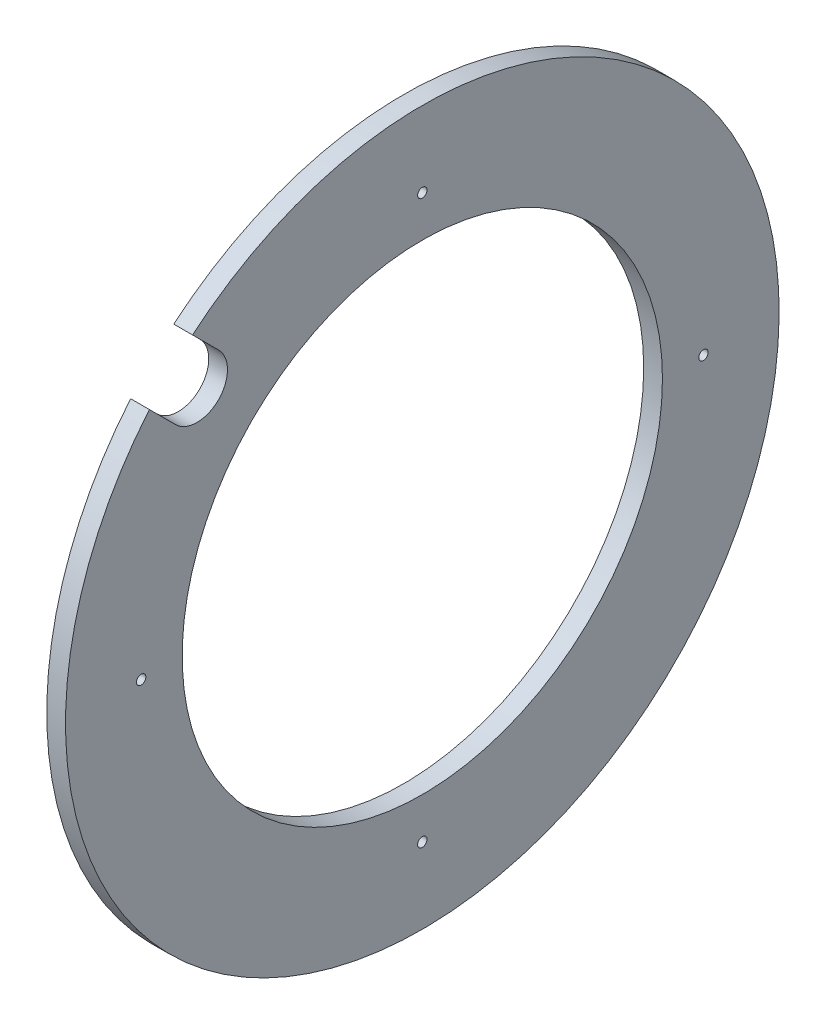
ISO-10303-21;
HEADER;
FILE_DESCRIPTION(('STEP AP214'),'2;1');
FILE_NAME('part.step','',(''),(''),'','','');
FILE_SCHEMA(('AUTOMOTIVE_DESIGN { 1 0 10303 214 1 1 1 1 }'));
ENDSEC;
DATA;
#1=APPLICATION_CONTEXT('core data for automotive mechanical design processes');
#2=APPLICATION_PROTOCOL_DEFINITION('international standard','automotive_design',2000,#1);
#3=PRODUCT_CONTEXT('',#1,'mechanical');
#4=PRODUCT('Part','Part','',(#3));
#5=PRODUCT_RELATED_PRODUCT_CATEGORY('part','',(#4));
#6=PRODUCT_DEFINITION_FORMATION('','',#4);
#7=PRODUCT_DEFINITION_CONTEXT('part definition',#1,'design');
#8=PRODUCT_DEFINITION('design','',#6,#7);
#9=PRODUCT_DEFINITION_SHAPE('','',#8);
#10=(LENGTH_UNIT() NAMED_UNIT(*) SI_UNIT(.MILLI.,.METRE.));
#11=(NAMED_UNIT(*) PLANE_ANGLE_UNIT() SI_UNIT($,.RADIAN.));
#12=(NAMED_UNIT(*) SI_UNIT($,.STERADIAN.) SOLID_ANGLE_UNIT());
#13=UNCERTAINTY_MEASURE_WITH_UNIT(LENGTH_MEASURE(1.E-05),#10,'distance_accuracy_value','');
#14=(GEOMETRIC_REPRESENTATION_CONTEXT(3) GLOBAL_UNCERTAINTY_ASSIGNED_CONTEXT((#13)) GLOBAL_UNIT_ASSIGNED_CONTEXT((#10,
#11,#12)) REPRESENTATION_CONTEXT('',''));
#15=CARTESIAN_POINT('',(0.,0.,0.));
#16=DIRECTION('',(0.,0.,1.));
#17=DIRECTION('',(1.,0.,0.));
#18=AXIS2_PLACEMENT_3D('',#15,#16,#17);
#19=CARTESIAN_POINT('',(4.,0.,0.));
#20=DIRECTION('',(1.,0.,0.));
#21=DIRECTION('',(0.,0.,-1.));
#22=AXIS2_PLACEMENT_3D('',#19,#20,#21);
#23=PLANE('',#22);
#24=DIRECTION('',(0.,-0.707106781186546,-0.707106781186549));
#25=VECTOR('',#24,1.);
#26=CARTESIAN_POINT('',(4.,43.4870670429726,52.6794551983979));
#27=LINE('',#26,#25);
#28=CARTESIAN_POINT('',(4.,49.0534680833858,58.2458562388111));
#29=VERTEX_POINT('',#28);
#30=CARTESIAN_POINT('',(4.,43.4870670429726,52.6794551983979));
#31=VERTEX_POINT('',#30);
#32=EDGE_CURVE('E83',#29,#31,#27,.T.);
#33=ORIENTED_EDGE('',*,*,#32,.F.);
#34=CARTESIAN_POINT('',(4.,0.,0.));
#35=DIRECTION('',(1.,0.,0.));
#36=DIRECTION('',(0.,0.,-1.));
#37=AXIS2_PLACEMENT_3D('',#34,#35,#36);
#38=CIRCLE('',#37,76.15);
#39=CARTESIAN_POINT('',(4.,58.2458562388109,49.053468083386));
#40=VERTEX_POINT('',#39);
#41=EDGE_CURVE('E95',#29,#40,#38,.T.);
#42=ORIENTED_EDGE('',*,*,#41,.T.);
#43=DIRECTION('',(0.,0.707106781186546,0.707106781186549));
#44=VECTOR('',#43,1.);
#45=CARTESIAN_POINT('',(4.,52.6794551983977,43.4870670429728));
#46=LINE('',#45,#44);
#47=CARTESIAN_POINT('',(4.,52.6794551983977,43.4870670429728));
#48=VERTEX_POINT('',#47);
#49=EDGE_CURVE('E51',#48,#40,#46,.T.);
#50=ORIENTED_EDGE('',*,*,#49,.F.);
#51=CARTESIAN_POINT('',(4.,48.0832611206851,48.0832611206853));
#52=DIRECTION('',(1.,0.,0.));
#53=DIRECTION('',(0.,0.,-1.));
#54=AXIS2_PLACEMENT_3D('',#51,#52,#53);
#55=CIRCLE('',#54,6.5);
#56=EDGE_CURVE('E86',#31,#48,#55,.T.);
#57=ORIENTED_EDGE('',*,*,#56,.F.);
#58=EDGE_LOOP('',(#33,#42,#50,#57));
#59=FACE_BOUND('',#58,.T.);
#60=CARTESIAN_POINT('',(4.,1.69795468502936E-12,-60.0000000000019));
#61=DIRECTION('',(1.,0.,0.));
#62=DIRECTION('',(0.,0.,-1.));
#63=AXIS2_PLACEMENT_3D('',#60,#61,#62);
#64=CIRCLE('',#63,0.999999999999998);
#65=CARTESIAN_POINT('',(4.,1.69795468502936E-12,-61.0000000000019));
#66=VERTEX_POINT('',#65);
#67=EDGE_CURVE('E107',#66,#66,#64,.T.);
#68=ORIENTED_EDGE('',*,*,#67,.F.);
#69=EDGE_LOOP('',(#68));
#70=FACE_BOUND('',#69,.T.);
#71=CARTESIAN_POINT('',(4.,-60.,-3.59206192068241E-12));
#72=DIRECTION('',(1.,0.,0.));
#73=DIRECTION('',(0.,0.,-1.));
#74=AXIS2_PLACEMENT_3D('',#71,#72,#73);
#75=CIRCLE('',#74,1.);
#76=CARTESIAN_POINT('',(4.,-60.,-1.00000000000359));
#77=VERTEX_POINT('',#76);
#78=EDGE_CURVE('E113',#77,#77,#75,.T.);
#79=ORIENTED_EDGE('',*,*,#78,.F.);
#80=EDGE_LOOP('',(#79));
#81=FACE_BOUND('',#80,.T.);
#82=CARTESIAN_POINT('',(4.,-1.70530256582424E-12,59.9999999999981));
#83=DIRECTION('',(1.,0.,0.));
#84=DIRECTION('',(0.,0.,-1.));
#85=AXIS2_PLACEMENT_3D('',#82,#83,#84);
#86=CIRCLE('',#85,0.999999999999998);
#87=CARTESIAN_POINT('',(4.,-1.70530256582424E-12,58.9999999999981));
#88=VERTEX_POINT('',#87);
#89=EDGE_CURVE('E102',#88,#88,#86,.T.);
#90=ORIENTED_EDGE('',*,*,#89,.F.);
#91=EDGE_LOOP('',(#90));
#92=FACE_BOUND('',#91,.T.);
#93=CARTESIAN_POINT('',(4.,60.,-1.96152550623697E-13));
#94=DIRECTION('',(1.,0.,0.));
#95=DIRECTION('',(0.,0.,-1.));
#96=AXIS2_PLACEMENT_3D('',#93,#94,#95);
#97=CIRCLE('',#96,1.);
#98=CARTESIAN_POINT('',(4.,60.,-1.0000000000002));
#99=VERTEX_POINT('',#98);
#100=EDGE_CURVE('E106',#99,#99,#97,.T.);
#101=ORIENTED_EDGE('',*,*,#100,.F.);
#102=EDGE_LOOP('',(#101));
#103=FACE_BOUND('',#102,.T.);
#104=CARTESIAN_POINT('',(4.,0.,0.));
#105=DIRECTION('',(1.,0.,0.));
#106=DIRECTION('',(0.,0.,-1.));
#107=AXIS2_PLACEMENT_3D('',#104,#105,#106);
#108=CIRCLE('',#107,51.25);
#109=CARTESIAN_POINT('',(4.,0.,-51.25));
#110=VERTEX_POINT('',#109);
#111=EDGE_CURVE('E127',#110,#110,#108,.T.);
#112=ORIENTED_EDGE('',*,*,#111,.F.);
#113=EDGE_LOOP('',(#112));
#114=FACE_BOUND('',#113,.T.);
#115=ADVANCED_FACE('F36',(#59,#70,#81,#92,#103,#114),#23,.T.);
#116=CARTESIAN_POINT('',(0.,0.,0.));
#117=DIRECTION('',(1.,0.,0.));
#118=DIRECTION('',(0.,0.,-1.));
#119=AXIS2_PLACEMENT_3D('',#116,#117,#118);
#120=PLANE('',#119);
#121=CARTESIAN_POINT('',(0.,1.69795468502936E-12,-60.0000000000019));
#122=DIRECTION('',(1.,0.,0.));
#123=DIRECTION('',(0.,0.,-1.));
#124=AXIS2_PLACEMENT_3D('',#121,#122,#123);
#125=CIRCLE('',#124,0.999999999999998);
#126=CARTESIAN_POINT('',(0.,1.69795468502936E-12,-61.0000000000019));
#127=VERTEX_POINT('',#126);
#128=EDGE_CURVE('E103',#127,#127,#125,.T.);
#129=ORIENTED_EDGE('',*,*,#128,.T.);
#130=EDGE_LOOP('',(#129));
#131=FACE_BOUND('',#130,.T.);
#132=CARTESIAN_POINT('',(0.,-60.,-3.59206192068241E-12));
#133=DIRECTION('',(1.,0.,0.));
#134=DIRECTION('',(0.,0.,-1.));
#135=AXIS2_PLACEMENT_3D('',#132,#133,#134);
#136=CIRCLE('',#135,1.);
#137=CARTESIAN_POINT('',(0.,-60.,-1.00000000000359));
#138=VERTEX_POINT('',#137);
#139=EDGE_CURVE('E110',#138,#138,#136,.T.);
#140=ORIENTED_EDGE('',*,*,#139,.T.);
#141=EDGE_LOOP('',(#140));
#142=FACE_BOUND('',#141,.T.);
#143=CARTESIAN_POINT('',(0.,-1.70530256582424E-12,59.9999999999981));
#144=DIRECTION('',(1.,0.,0.));
#145=DIRECTION('',(0.,0.,-1.));
#146=AXIS2_PLACEMENT_3D('',#143,#144,#145);
#147=CIRCLE('',#146,0.999999999999998);
#148=CARTESIAN_POINT('',(0.,-1.70530256582424E-12,58.9999999999981));
#149=VERTEX_POINT('',#148);
#150=EDGE_CURVE('E116',#149,#149,#147,.T.);
#151=ORIENTED_EDGE('',*,*,#150,.T.);
#152=EDGE_LOOP('',(#151));
#153=FACE_BOUND('',#152,.T.);
#154=CARTESIAN_POINT('',(0.,60.,-1.96152550623697E-13));
#155=DIRECTION('',(1.,0.,0.));
#156=DIRECTION('',(0.,0.,-1.));
#157=AXIS2_PLACEMENT_3D('',#154,#155,#156);
#158=CIRCLE('',#157,1.);
#159=CARTESIAN_POINT('',(0.,60.,-1.0000000000002));
#160=VERTEX_POINT('',#159);
#161=EDGE_CURVE('E121',#160,#160,#158,.T.);
#162=ORIENTED_EDGE('',*,*,#161,.T.);
#163=EDGE_LOOP('',(#162));
#164=FACE_BOUND('',#163,.T.);
#165=CARTESIAN_POINT('',(0.,0.,0.));
#166=DIRECTION('',(1.,0.,0.));
#167=DIRECTION('',(0.,0.,-1.));
#168=AXIS2_PLACEMENT_3D('',#165,#166,#167);
#169=CIRCLE('',#168,76.15);
#170=CARTESIAN_POINT('',(0.,49.0534680833858,58.2458562388111));
#171=VERTEX_POINT('',#170);
#172=CARTESIAN_POINT('',(0.,58.2458562388109,49.053468083386));
#173=VERTEX_POINT('',#172);
#174=EDGE_CURVE('E130',#171,#173,#169,.T.);
#175=ORIENTED_EDGE('',*,*,#174,.F.);
#176=DIRECTION('',(0.,-0.707106781186546,-0.707106781186549));
#177=VECTOR('',#176,1.);
#178=CARTESIAN_POINT('',(0.,-4.59619407771256,4.59619407771254));
#179=LINE('',#178,#177);
#180=CARTESIAN_POINT('',(0.,43.4870670429726,52.6794551983979));
#181=VERTEX_POINT('',#180);
#182=EDGE_CURVE('E59',#171,#181,#179,.T.);
#183=ORIENTED_EDGE('',*,*,#182,.T.);
#184=CARTESIAN_POINT('',(0.,48.0832611206851,48.0832611206853));
#185=DIRECTION('',(1.,0.,0.));
#186=DIRECTION('',(0.,0.,-1.));
#187=AXIS2_PLACEMENT_3D('',#184,#185,#186);
#188=CIRCLE('',#187,6.5);
#189=CARTESIAN_POINT('',(0.,52.6794551983977,43.4870670429728));
#190=VERTEX_POINT('',#189);
#191=EDGE_CURVE('E11',#181,#190,#188,.T.);
#192=ORIENTED_EDGE('',*,*,#191,.T.);
#193=DIRECTION('',(0.,0.707106781186546,0.707106781186549));
#194=VECTOR('',#193,1.);
#195=CARTESIAN_POINT('',(0.,4.59619407771259,-4.59619407771256));
#196=LINE('',#195,#194);
#197=EDGE_CURVE('E80',#190,#173,#196,.T.);
#198=ORIENTED_EDGE('',*,*,#197,.T.);
#199=EDGE_LOOP('',(#175,#183,#192,#198));
#200=FACE_BOUND('',#199,.T.);
#201=CARTESIAN_POINT('',(0.,0.,0.));
#202=DIRECTION('',(1.,0.,0.));
#203=DIRECTION('',(0.,0.,-1.));
#204=AXIS2_PLACEMENT_3D('',#201,#202,#203);
#205=CIRCLE('',#204,51.25);
#206=CARTESIAN_POINT('',(0.,0.,-51.25));
#207=VERTEX_POINT('',#206);
#208=EDGE_CURVE('E124',#207,#207,#205,.T.);
#209=ORIENTED_EDGE('',*,*,#208,.T.);
#210=EDGE_LOOP('',(#209));
#211=FACE_BOUND('',#210,.T.);
#212=ADVANCED_FACE('F140',(#131,#142,#153,#164,#200,#211),#120,.F.);
#213=CARTESIAN_POINT('',(4.,0.,0.));
#214=DIRECTION('',(-1.,0.,0.));
#215=DIRECTION('',(0.,0.,1.));
#216=AXIS2_PLACEMENT_3D('',#213,#214,#215);
#217=CYLINDRICAL_SURFACE('',#216,76.15);
#218=ORIENTED_EDGE('',*,*,#41,.F.);
#219=DIRECTION('',(-1.,0.,0.));
#220=VECTOR('',#219,1.);
#221=CARTESIAN_POINT('',(4.,49.0534680833858,58.2458562388111));
#222=LINE('',#221,#220);
#223=EDGE_CURVE('E44',#29,#171,#222,.T.);
#224=ORIENTED_EDGE('',*,*,#223,.T.);
#225=ORIENTED_EDGE('',*,*,#174,.T.);
#226=DIRECTION('',(-1.,0.,0.));
#227=VECTOR('',#226,1.);
#228=CARTESIAN_POINT('',(4.,58.2458562388109,49.053468083386));
#229=LINE('',#228,#227);
#230=EDGE_CURVE('E134',#173,#40,#229,.F.);
#231=ORIENTED_EDGE('',*,*,#230,.T.);
#232=EDGE_LOOP('',(#218,#224,#225,#231));
#233=FACE_BOUND('',#232,.T.);
#234=ADVANCED_FACE('F38',(#233),#217,.T.);
#235=CARTESIAN_POINT('',(4.,0.,0.));
#236=DIRECTION('',(-1.,0.,0.));
#237=DIRECTION('',(0.,0.,1.));
#238=AXIS2_PLACEMENT_3D('',#235,#236,#237);
#239=CYLINDRICAL_SURFACE('',#238,51.25);
#240=ORIENTED_EDGE('',*,*,#111,.T.);
#241=EDGE_LOOP('',(#240));
#242=FACE_BOUND('',#241,.T.);
#243=ORIENTED_EDGE('',*,*,#208,.F.);
#244=EDGE_LOOP('',(#243));
#245=FACE_BOUND('',#244,.T.);
#246=ADVANCED_FACE('F159',(#242,#245),#239,.F.);
#247=CARTESIAN_POINT('',(0.,60.,-1.96152550623697E-13));
#248=DIRECTION('',(1.,0.,0.));
#249=DIRECTION('',(0.,0.,-1.));
#250=AXIS2_PLACEMENT_3D('',#247,#248,#249);
#251=CYLINDRICAL_SURFACE('',#250,1.);
#252=ORIENTED_EDGE('',*,*,#161,.F.);
#253=EDGE_LOOP('',(#252));
#254=FACE_BOUND('',#253,.T.);
#255=ORIENTED_EDGE('',*,*,#100,.T.);
#256=EDGE_LOOP('',(#255));
#257=FACE_BOUND('',#256,.T.);
#258=ADVANCED_FACE('F162',(#254,#257),#251,.F.);
#259=CARTESIAN_POINT('',(0.,-1.70530256582424E-12,59.9999999999981));
#260=DIRECTION('',(1.,0.,0.));
#261=DIRECTION('',(0.,0.,-1.));
#262=AXIS2_PLACEMENT_3D('',#259,#260,#261);
#263=CYLINDRICAL_SURFACE('',#262,0.999999999999998);
#264=ORIENTED_EDGE('',*,*,#150,.F.);
#265=EDGE_LOOP('',(#264));
#266=FACE_BOUND('',#265,.T.);
#267=ORIENTED_EDGE('',*,*,#89,.T.);
#268=EDGE_LOOP('',(#267));
#269=FACE_BOUND('',#268,.T.);
#270=ADVANCED_FACE('F166',(#266,#269),#263,.F.);
#271=CARTESIAN_POINT('',(0.,-60.,-3.59206192068241E-12));
#272=DIRECTION('',(1.,0.,0.));
#273=DIRECTION('',(0.,0.,-1.));
#274=AXIS2_PLACEMENT_3D('',#271,#272,#273);
#275=CYLINDRICAL_SURFACE('',#274,1.);
#276=ORIENTED_EDGE('',*,*,#139,.F.);
#277=EDGE_LOOP('',(#276));
#278=FACE_BOUND('',#277,.T.);
#279=ORIENTED_EDGE('',*,*,#78,.T.);
#280=EDGE_LOOP('',(#279));
#281=FACE_BOUND('',#280,.T.);
#282=ADVANCED_FACE('F170',(#278,#281),#275,.F.);
#283=CARTESIAN_POINT('',(0.,1.69795468502936E-12,-60.0000000000019));
#284=DIRECTION('',(1.,0.,0.));
#285=DIRECTION('',(0.,0.,-1.));
#286=AXIS2_PLACEMENT_3D('',#283,#284,#285);
#287=CYLINDRICAL_SURFACE('',#286,0.999999999999998);
#288=ORIENTED_EDGE('',*,*,#128,.F.);
#289=EDGE_LOOP('',(#288));
#290=FACE_BOUND('',#289,.T.);
#291=ORIENTED_EDGE('',*,*,#67,.T.);
#292=EDGE_LOOP('',(#291));
#293=FACE_BOUND('',#292,.T.);
#294=ADVANCED_FACE('F150',(#290,#293),#287,.F.);
#295=CARTESIAN_POINT('',(-6.,48.0832611206851,48.0832611206853));
#296=DIRECTION('',(1.,0.,0.));
#297=DIRECTION('',(0.,0.,-1.));
#298=AXIS2_PLACEMENT_3D('',#295,#296,#297);
#299=CYLINDRICAL_SURFACE('',#298,6.5);
#300=DIRECTION('',(1.,0.,0.));
#301=VECTOR('',#300,1.);
#302=CARTESIAN_POINT('',(-6.,43.4870670429726,52.6794551983979));
#303=LINE('',#302,#301);
#304=EDGE_CURVE('E82',#181,#31,#303,.T.);
#305=ORIENTED_EDGE('',*,*,#304,.T.);
#306=ORIENTED_EDGE('',*,*,#56,.T.);
#307=DIRECTION('',(1.,0.,0.));
#308=VECTOR('',#307,1.);
#309=CARTESIAN_POINT('',(-6.,52.6794551983977,43.4870670429728));
#310=LINE('',#309,#308);
#311=EDGE_CURVE('E76',#190,#48,#310,.T.);
#312=ORIENTED_EDGE('',*,*,#311,.F.);
#313=ORIENTED_EDGE('',*,*,#191,.F.);
#314=EDGE_LOOP('',(#305,#306,#312,#313));
#315=FACE_BOUND('',#314,.T.);
#316=ADVANCED_FACE('F87',(#315),#299,.F.);
#317=CARTESIAN_POINT('',(-6.,43.4870670429726,52.6794551983979));
#318=DIRECTION('',(0.,-0.707106781186549,0.707106781186546));
#319=DIRECTION('',(0.,-0.707106781186546,-0.707106781186549));
#320=AXIS2_PLACEMENT_3D('',#317,#318,#319);
#321=PLANE('',#320);
#322=ORIENTED_EDGE('',*,*,#223,.F.);
#323=ORIENTED_EDGE('',*,*,#32,.T.);
#324=ORIENTED_EDGE('',*,*,#304,.F.);
#325=ORIENTED_EDGE('',*,*,#182,.F.);
#326=EDGE_LOOP('',(#322,#323,#324,#325));
#327=FACE_BOUND('',#326,.T.);
#328=ADVANCED_FACE('F142',(#327),#321,.F.);
#329=CARTESIAN_POINT('',(-6.,52.6794551983977,43.4870670429728));
#330=DIRECTION('',(0.,0.707106781186549,-0.707106781186546));
#331=DIRECTION('',(0.,0.707106781186546,0.707106781186549));
#332=AXIS2_PLACEMENT_3D('',#329,#330,#331);
#333=PLANE('',#332);
#334=ORIENTED_EDGE('',*,*,#311,.T.);
#335=ORIENTED_EDGE('',*,*,#49,.T.);
#336=ORIENTED_EDGE('',*,*,#230,.F.);
#337=ORIENTED_EDGE('',*,*,#197,.F.);
#338=EDGE_LOOP('',(#334,#335,#336,#337));
#339=FACE_BOUND('',#338,.T.);
#340=ADVANCED_FACE('F78',(#339),#333,.F.);
#341=CLOSED_SHELL('',(#115,#212,#234,#246,#258,#270,#282,#294,#316,#328,#340));
#342=MANIFOLD_SOLID_BREP('B2',#341);
#343=ADVANCED_BREP_SHAPE_REPRESENTATION('',(#18,#342),#14);
#344=SHAPE_DEFINITION_REPRESENTATION(#9,#343);
ENDSEC;
END-ISO-10303-21;
